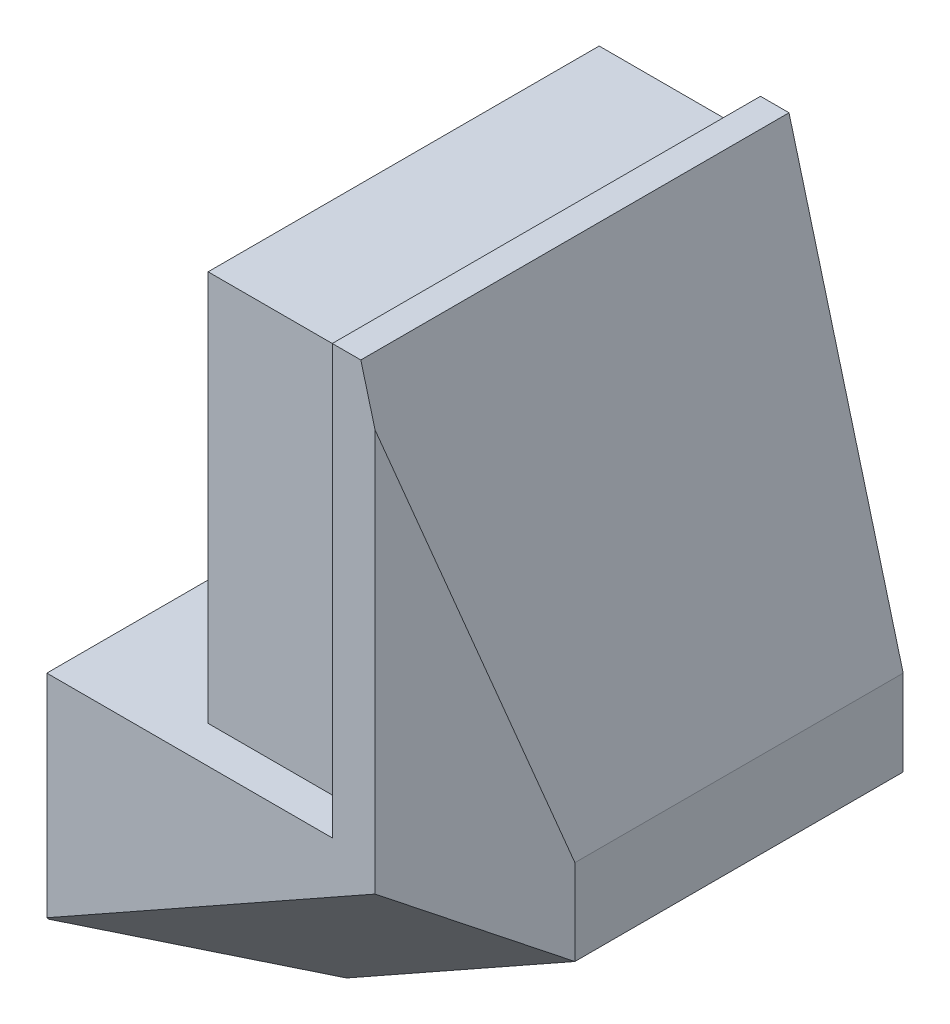
ISO-10303-21;
HEADER;
FILE_DESCRIPTION(('STEP AP214'),'2;1');
FILE_NAME('part.step','',(''),(''),'','','');
FILE_SCHEMA(('AUTOMOTIVE_DESIGN { 1 0 10303 214 1 1 1 1 }'));
ENDSEC;
DATA;
#1=APPLICATION_CONTEXT('core data for automotive mechanical design processes');
#2=APPLICATION_PROTOCOL_DEFINITION('international standard','automotive_design',2000,#1);
#3=PRODUCT_CONTEXT('',#1,'mechanical');
#4=PRODUCT('Part','Part','',(#3));
#5=PRODUCT_RELATED_PRODUCT_CATEGORY('part','',(#4));
#6=PRODUCT_DEFINITION_FORMATION('','',#4);
#7=PRODUCT_DEFINITION_CONTEXT('part definition',#1,'design');
#8=PRODUCT_DEFINITION('design','',#6,#7);
#9=PRODUCT_DEFINITION_SHAPE('','',#8);
#10=(LENGTH_UNIT() NAMED_UNIT(*) SI_UNIT(.MILLI.,.METRE.));
#11=(NAMED_UNIT(*) PLANE_ANGLE_UNIT() SI_UNIT($,.RADIAN.));
#12=(NAMED_UNIT(*) SI_UNIT($,.STERADIAN.) SOLID_ANGLE_UNIT());
#13=UNCERTAINTY_MEASURE_WITH_UNIT(LENGTH_MEASURE(1.E-05),#10,'distance_accuracy_value','');
#14=(GEOMETRIC_REPRESENTATION_CONTEXT(3) GLOBAL_UNCERTAINTY_ASSIGNED_CONTEXT((#13)) GLOBAL_UNIT_ASSIGNED_CONTEXT((#10,
#11,#12)) REPRESENTATION_CONTEXT('',''));
#15=CARTESIAN_POINT('',(0.,0.,0.));
#16=DIRECTION('',(0.,0.,1.));
#17=DIRECTION('',(1.,0.,0.));
#18=AXIS2_PLACEMENT_3D('',#15,#16,#17);
#19=CARTESIAN_POINT('',(0.,0.,30.));
#20=DIRECTION('',(1.,0.,0.));
#21=DIRECTION('',(0.,0.,-1.));
#22=AXIS2_PLACEMENT_3D('',#19,#20,#21);
#23=PLANE('',#22);
#24=DIRECTION('',(0.,-1.,0.));
#25=VECTOR('',#24,1.);
#26=CARTESIAN_POINT('',(0.,0.,0.));
#27=LINE('',#26,#25);
#28=CARTESIAN_POINT('',(0.,30.,0.));
#29=VERTEX_POINT('',#28);
#30=CARTESIAN_POINT('',(0.,0.,0.));
#31=VERTEX_POINT('',#30);
#32=EDGE_CURVE('E275',#29,#31,#27,.T.);
#33=ORIENTED_EDGE('',*,*,#32,.T.);
#34=DIRECTION('',(0.,0.,-1.));
#35=VECTOR('',#34,1.);
#36=CARTESIAN_POINT('',(0.,0.,30.));
#37=LINE('',#36,#35);
#38=CARTESIAN_POINT('',(0.,0.,30.));
#39=VERTEX_POINT('',#38);
#40=EDGE_CURVE('E288',#39,#31,#37,.T.);
#41=ORIENTED_EDGE('',*,*,#40,.F.);
#42=DIRECTION('',(0.,-1.,0.));
#43=VECTOR('',#42,1.);
#44=CARTESIAN_POINT('',(0.,0.,30.));
#45=LINE('',#44,#43);
#46=CARTESIAN_POINT('',(0.,30.,30.));
#47=VERTEX_POINT('',#46);
#48=EDGE_CURVE('E285',#47,#39,#45,.T.);
#49=ORIENTED_EDGE('',*,*,#48,.F.);
#50=DIRECTION('',(0.,0.,-1.));
#51=VECTOR('',#50,1.);
#52=CARTESIAN_POINT('',(0.,30.,30.));
#53=LINE('',#52,#51);
#54=EDGE_CURVE('E319',#47,#29,#53,.T.);
#55=ORIENTED_EDGE('',*,*,#54,.T.);
#56=EDGE_LOOP('',(#33,#41,#49,#55));
#57=FACE_BOUND('',#56,.T.);
#58=DIRECTION('',(0.,0.,-1.));
#59=VECTOR('',#58,1.);
#60=CARTESIAN_POINT('',(0.,28.7,28.7));
#61=LINE('',#60,#59);
#62=CARTESIAN_POINT('',(0.,28.7,28.7));
#63=VERTEX_POINT('',#62);
#64=CARTESIAN_POINT('',(0.,28.7,1.3));
#65=VERTEX_POINT('',#64);
#66=EDGE_CURVE('E198',#63,#65,#61,.T.);
#67=ORIENTED_EDGE('',*,*,#66,.F.);
#68=DIRECTION('',(0.,1.,0.));
#69=VECTOR('',#68,1.);
#70=CARTESIAN_POINT('',(0.,1.3,28.7));
#71=LINE('',#70,#69);
#72=CARTESIAN_POINT('',(0.,1.3,28.7));
#73=VERTEX_POINT('',#72);
#74=EDGE_CURVE('E220',#73,#63,#71,.T.);
#75=ORIENTED_EDGE('',*,*,#74,.F.);
#76=DIRECTION('',(0.,0.,1.));
#77=VECTOR('',#76,1.);
#78=CARTESIAN_POINT('',(0.,1.3,1.3));
#79=LINE('',#78,#77);
#80=CARTESIAN_POINT('',(0.,1.3,1.3));
#81=VERTEX_POINT('',#80);
#82=EDGE_CURVE('E235',#81,#73,#79,.T.);
#83=ORIENTED_EDGE('',*,*,#82,.F.);
#84=DIRECTION('',(0.,-1.,0.));
#85=VECTOR('',#84,1.);
#86=CARTESIAN_POINT('',(0.,28.7,1.3));
#87=LINE('',#86,#85);
#88=EDGE_CURVE('E65',#65,#81,#87,.T.);
#89=ORIENTED_EDGE('',*,*,#88,.F.);
#90=EDGE_LOOP('',(#67,#75,#83,#89));
#91=FACE_BOUND('',#90,.T.);
#92=ADVANCED_FACE('F39',(#57,#91),#23,.F.);
#93=CARTESIAN_POINT('',(-20.,0.,30.));
#94=DIRECTION('',(0.,-1.,0.));
#95=DIRECTION('',(0.,0.,-1.));
#96=AXIS2_PLACEMENT_3D('',#93,#94,#95);
#97=PLANE('',#96);
#98=CARTESIAN_POINT('',(-12.5,0.,15.));
#99=DIRECTION('',(0.,-1.,0.));
#100=DIRECTION('',(0.,0.,-1.));
#101=AXIS2_PLACEMENT_3D('',#98,#99,#100);
#102=CIRCLE('',#101,2.75);
#103=CARTESIAN_POINT('',(-12.5,0.,12.25));
#104=VERTEX_POINT('',#103);
#105=EDGE_CURVE('E43',#104,#104,#102,.T.);
#106=ORIENTED_EDGE('',*,*,#105,.T.);
#107=EDGE_LOOP('',(#106));
#108=FACE_BOUND('',#107,.T.);
#109=DIRECTION('',(-1.,0.,0.));
#110=VECTOR('',#109,1.);
#111=CARTESIAN_POINT('',(-20.,0.,0.));
#112=LINE('',#111,#110);
#113=CARTESIAN_POINT('',(-20.,0.,0.));
#114=VERTEX_POINT('',#113);
#115=EDGE_CURVE('E264',#31,#114,#112,.T.);
#116=ORIENTED_EDGE('',*,*,#115,.T.);
#117=DIRECTION('',(0.,0.,-1.));
#118=VECTOR('',#117,1.);
#119=CARTESIAN_POINT('',(-20.,0.,30.));
#120=LINE('',#119,#118);
#121=CARTESIAN_POINT('',(-20.,0.,30.));
#122=VERTEX_POINT('',#121);
#123=EDGE_CURVE('E339',#122,#114,#120,.T.);
#124=ORIENTED_EDGE('',*,*,#123,.F.);
#125=DIRECTION('',(-1.,0.,0.));
#126=VECTOR('',#125,1.);
#127=CARTESIAN_POINT('',(-20.,0.,30.));
#128=LINE('',#127,#126);
#129=EDGE_CURVE('E270',#39,#122,#128,.T.);
#130=ORIENTED_EDGE('',*,*,#129,.F.);
#131=ORIENTED_EDGE('',*,*,#40,.T.);
#132=EDGE_LOOP('',(#116,#124,#130,#131));
#133=FACE_BOUND('',#132,.T.);
#134=ADVANCED_FACE('F370',(#108,#133),#97,.F.);
#135=CARTESIAN_POINT('',(-20.,-15.,30.));
#136=DIRECTION('',(1.,0.,0.));
#137=DIRECTION('',(0.,0.,-1.));
#138=AXIS2_PLACEMENT_3D('',#135,#136,#137);
#139=PLANE('',#138);
#140=DIRECTION('',(0.,0.,-1.));
#141=VECTOR('',#140,1.);
#142=CARTESIAN_POINT('',(-20.,-15.,30.));
#143=LINE('',#142,#141);
#144=CARTESIAN_POINT('',(-20.,-15.,29.8636573548558));
#145=VERTEX_POINT('',#144);
#146=CARTESIAN_POINT('',(-20.,-15.,0.));
#147=VERTEX_POINT('',#146);
#148=EDGE_CURVE('E336',#145,#147,#143,.T.);
#149=ORIENTED_EDGE('',*,*,#148,.F.);
#150=DIRECTION('',(0.,0.753854625211506,0.657041249882547));
#151=VECTOR('',#150,1.);
#152=CARTESIAN_POINT('',(-20.,-7.95937034712714,36.0000979262535));
#153=LINE('',#152,#151);
#154=CARTESIAN_POINT('',(-20.,-14.843567609075,30.));
#155=VERTEX_POINT('',#154);
#156=EDGE_CURVE('E356',#145,#155,#153,.T.);
#157=ORIENTED_EDGE('',*,*,#156,.T.);
#158=DIRECTION('',(0.,-1.,0.));
#159=VECTOR('',#158,1.);
#160=CARTESIAN_POINT('',(-20.,-15.,30.));
#161=LINE('',#160,#159);
#162=EDGE_CURVE('E274',#122,#155,#161,.T.);
#163=ORIENTED_EDGE('',*,*,#162,.F.);
#164=ORIENTED_EDGE('',*,*,#123,.T.);
#165=DIRECTION('',(0.,-1.,0.));
#166=VECTOR('',#165,1.);
#167=CARTESIAN_POINT('',(-20.,-15.,0.));
#168=LINE('',#167,#166);
#169=EDGE_CURVE('E292',#114,#147,#168,.T.);
#170=ORIENTED_EDGE('',*,*,#169,.T.);
#171=EDGE_LOOP('',(#149,#157,#163,#164,#170));
#172=FACE_BOUND('',#171,.T.);
#173=ADVANCED_FACE('F395',(#172),#139,.F.);
#174=CARTESIAN_POINT('',(-6.,-15.,30.));
#175=DIRECTION('',(0.,1.,0.));
#176=DIRECTION('',(0.,0.,1.));
#177=AXIS2_PLACEMENT_3D('',#174,#175,#176);
#178=PLANE('',#177);
#179=CARTESIAN_POINT('',(-12.5,-15.,15.));
#180=DIRECTION('',(0.,-1.,0.));
#181=DIRECTION('',(0.,0.,-1.));
#182=AXIS2_PLACEMENT_3D('',#179,#180,#181);
#183=CIRCLE('',#182,5.);
#184=CARTESIAN_POINT('',(-12.5,-15.,10.));
#185=VERTEX_POINT('',#184);
#186=EDGE_CURVE('E265',#185,#185,#183,.T.);
#187=ORIENTED_EDGE('',*,*,#186,.F.);
#188=EDGE_LOOP('',(#187));
#189=FACE_BOUND('',#188,.T.);
#190=DIRECTION('',(0.,0.,-1.));
#191=VECTOR('',#190,1.);
#192=CARTESIAN_POINT('',(-6.,-15.,30.));
#193=LINE('',#192,#191);
#194=CARTESIAN_POINT('',(-6.,-15.,23.));
#195=VERTEX_POINT('',#194);
#196=CARTESIAN_POINT('',(-6.,-15.,0.));
#197=VERTEX_POINT('',#196);
#198=EDGE_CURVE('E333',#195,#197,#193,.T.);
#199=ORIENTED_EDGE('',*,*,#198,.F.);
#200=DIRECTION('',(-0.897897597554297,0.,0.440204389240068));
#201=VECTOR('',#200,1.);
#202=CARTESIAN_POINT('',(-2.6915132262833,-15.,21.3779771730097));
#203=LINE('',#202,#201);
#204=EDGE_CURVE('E353',#195,#145,#203,.T.);
#205=ORIENTED_EDGE('',*,*,#204,.T.);
#206=ORIENTED_EDGE('',*,*,#148,.T.);
#207=DIRECTION('',(1.,0.,0.));
#208=VECTOR('',#207,1.);
#209=CARTESIAN_POINT('',(-6.,-15.,0.));
#210=LINE('',#209,#208);
#211=EDGE_CURVE('E296',#147,#197,#210,.T.);
#212=ORIENTED_EDGE('',*,*,#211,.T.);
#213=EDGE_LOOP('',(#199,#205,#206,#212));
#214=FACE_BOUND('',#213,.T.);
#215=ADVANCED_FACE('F417',(#189,#214),#178,.F.);
#216=CARTESIAN_POINT('',(10.,-6.,30.));
#217=DIRECTION('',(-0.490261239632559,0.871575537124549,0.));
#218=DIRECTION('',(-0.871575537124549,-0.490261239632559,0.));
#219=AXIS2_PLACEMENT_3D('',#216,#217,#218);
#220=PLANE('',#219);
#221=DIRECTION('',(0.,0.,-1.));
#222=VECTOR('',#221,1.);
#223=CARTESIAN_POINT('',(10.,-6.,30.));
#224=LINE('',#223,#222);
#225=CARTESIAN_POINT('',(10.,-6.,23.));
#226=VERTEX_POINT('',#225);
#227=CARTESIAN_POINT('',(10.,-6.,0.));
#228=VERTEX_POINT('',#227);
#229=EDGE_CURVE('E330',#226,#228,#224,.T.);
#230=ORIENTED_EDGE('',*,*,#229,.F.);
#231=DIRECTION('',(-0.871575537124549,-0.490261239632559,0.));
#232=VECTOR('',#231,1.);
#233=CARTESIAN_POINT('',(-6.,-15.,23.));
#234=LINE('',#233,#232);
#235=EDGE_CURVE('E350',#226,#195,#234,.T.);
#236=ORIENTED_EDGE('',*,*,#235,.T.);
#237=ORIENTED_EDGE('',*,*,#198,.T.);
#238=DIRECTION('',(0.871575537124549,0.490261239632559,0.));
#239=VECTOR('',#238,1.);
#240=CARTESIAN_POINT('',(10.,-6.,0.));
#241=LINE('',#240,#239);
#242=EDGE_CURVE('E300',#197,#228,#241,.T.);
#243=ORIENTED_EDGE('',*,*,#242,.T.);
#244=EDGE_LOOP('',(#230,#236,#237,#243));
#245=FACE_BOUND('',#244,.T.);
#246=ADVANCED_FACE('F413',(#245),#220,.F.);
#247=CARTESIAN_POINT('',(10.,0.,30.));
#248=DIRECTION('',(-1.,0.,0.));
#249=DIRECTION('',(0.,-1.,0.));
#250=AXIS2_PLACEMENT_3D('',#247,#248,#249);
#251=PLANE('',#250);
#252=DIRECTION('',(0.,0.,-1.));
#253=VECTOR('',#252,1.);
#254=CARTESIAN_POINT('',(10.,0.,30.));
#255=LINE('',#254,#253);
#256=CARTESIAN_POINT('',(10.,0.,23.));
#257=VERTEX_POINT('',#256);
#258=CARTESIAN_POINT('',(10.,0.,0.));
#259=VERTEX_POINT('',#258);
#260=EDGE_CURVE('E327',#257,#259,#255,.T.);
#261=ORIENTED_EDGE('',*,*,#260,.F.);
#262=DIRECTION('',(0.,-1.,0.));
#263=VECTOR('',#262,1.);
#264=CARTESIAN_POINT('',(10.,-6.,23.));
#265=LINE('',#264,#263);
#266=EDGE_CURVE('E11',#257,#226,#265,.T.);
#267=ORIENTED_EDGE('',*,*,#266,.T.);
#268=ORIENTED_EDGE('',*,*,#229,.T.);
#269=DIRECTION('',(0.,1.,0.));
#270=VECTOR('',#269,1.);
#271=CARTESIAN_POINT('',(10.,0.,0.));
#272=LINE('',#271,#270);
#273=EDGE_CURVE('E304',#228,#259,#272,.T.);
#274=ORIENTED_EDGE('',*,*,#273,.T.);
#275=EDGE_LOOP('',(#261,#267,#268,#274));
#276=FACE_BOUND('',#275,.T.);
#277=ADVANCED_FACE('F409',(#276),#251,.F.);
#278=CARTESIAN_POINT('',(2.,30.,30.));
#279=DIRECTION('',(-0.966234939601246,-0.257662650560332,0.));
#280=DIRECTION('',(0.257662650560332,-0.966234939601246,0.));
#281=AXIS2_PLACEMENT_3D('',#278,#279,#280);
#282=PLANE('',#281);
#283=DIRECTION('',(-0.257662650560332,0.966234939601246,0.));
#284=VECTOR('',#283,1.);
#285=CARTESIAN_POINT('',(2.,30.,30.));
#286=LINE('',#285,#284);
#287=CARTESIAN_POINT('',(3.00000000000002,26.2499999999999,30.));
#288=VERTEX_POINT('',#287);
#289=CARTESIAN_POINT('',(2.,30.,30.));
#290=VERTEX_POINT('',#289);
#291=EDGE_CURVE('E279',#288,#290,#286,.T.);
#292=ORIENTED_EDGE('',*,*,#291,.F.);
#293=DIRECTION('',(0.249513144620722,-0.935674292327708,-0.249513144620723));
#294=VECTOR('',#293,1.);
#295=CARTESIAN_POINT('',(9.1284046692607,3.26848249027238,23.8715953307393));
#296=LINE('',#295,#294);
#297=EDGE_CURVE('E49',#288,#257,#296,.T.);
#298=ORIENTED_EDGE('',*,*,#297,.T.);
#299=ORIENTED_EDGE('',*,*,#260,.T.);
#300=DIRECTION('',(-0.257662650560332,0.966234939601246,0.));
#301=VECTOR('',#300,1.);
#302=CARTESIAN_POINT('',(2.,30.,0.));
#303=LINE('',#302,#301);
#304=CARTESIAN_POINT('',(2.,30.,0.));
#305=VERTEX_POINT('',#304);
#306=EDGE_CURVE('E308',#259,#305,#303,.T.);
#307=ORIENTED_EDGE('',*,*,#306,.T.);
#308=DIRECTION('',(0.,0.,-1.));
#309=VECTOR('',#308,1.);
#310=CARTESIAN_POINT('',(2.,30.,30.));
#311=LINE('',#310,#309);
#312=EDGE_CURVE('E323',#290,#305,#311,.T.);
#313=ORIENTED_EDGE('',*,*,#312,.F.);
#314=EDGE_LOOP('',(#292,#298,#299,#307,#313));
#315=FACE_BOUND('',#314,.T.);
#316=ADVANCED_FACE('F405',(#315),#282,.F.);
#317=CARTESIAN_POINT('',(0.,30.,30.));
#318=DIRECTION('',(0.,-1.,0.));
#319=DIRECTION('',(0.,0.,-1.));
#320=AXIS2_PLACEMENT_3D('',#317,#318,#319);
#321=PLANE('',#320);
#322=DIRECTION('',(-1.,0.,0.));
#323=VECTOR('',#322,1.);
#324=CARTESIAN_POINT('',(0.,30.,0.));
#325=LINE('',#324,#323);
#326=EDGE_CURVE('E311',#305,#29,#325,.T.);
#327=ORIENTED_EDGE('',*,*,#326,.T.);
#328=ORIENTED_EDGE('',*,*,#54,.F.);
#329=DIRECTION('',(-1.,0.,0.));
#330=VECTOR('',#329,1.);
#331=CARTESIAN_POINT('',(0.,30.,30.));
#332=LINE('',#331,#330);
#333=EDGE_CURVE('E282',#290,#47,#332,.T.);
#334=ORIENTED_EDGE('',*,*,#333,.F.);
#335=ORIENTED_EDGE('',*,*,#312,.T.);
#336=EDGE_LOOP('',(#327,#328,#334,#335));
#337=FACE_BOUND('',#336,.T.);
#338=ADVANCED_FACE('F401',(#337),#321,.F.);
#339=CARTESIAN_POINT('',(0.,0.,30.));
#340=DIRECTION('',(0.,0.,1.));
#341=DIRECTION('',(1.,0.,0.));
#342=AXIS2_PLACEMENT_3D('',#339,#340,#341);
#343=PLANE('',#342);
#344=ORIENTED_EDGE('',*,*,#162,.T.);
#345=DIRECTION('',(0.871575537124549,0.490261239632559,0.));
#346=VECTOR('',#345,1.);
#347=CARTESIAN_POINT('',(6.56817132257209,0.101028759871837,30.));
#348=LINE('',#347,#346);
#349=CARTESIAN_POINT('',(3.00000000000001,-1.90606760907496,30.));
#350=VERTEX_POINT('',#349);
#351=EDGE_CURVE('E346',#155,#350,#348,.T.);
#352=ORIENTED_EDGE('',*,*,#351,.T.);
#353=DIRECTION('',(0.,1.,0.));
#354=VECTOR('',#353,1.);
#355=CARTESIAN_POINT('',(3.00000000000001,0.,30.));
#356=LINE('',#355,#354);
#357=EDGE_CURVE('E343',#350,#288,#356,.T.);
#358=ORIENTED_EDGE('',*,*,#357,.T.);
#359=ORIENTED_EDGE('',*,*,#291,.T.);
#360=ORIENTED_EDGE('',*,*,#333,.T.);
#361=ORIENTED_EDGE('',*,*,#48,.T.);
#362=ORIENTED_EDGE('',*,*,#129,.T.);
#363=EDGE_LOOP('',(#344,#352,#358,#359,#360,#361,#362));
#364=FACE_BOUND('',#363,.T.);
#365=ADVANCED_FACE('F404',(#364),#343,.T.);
#366=CARTESIAN_POINT('',(0.,0.,0.));
#367=DIRECTION('',(0.,0.,1.));
#368=DIRECTION('',(1.,0.,0.));
#369=AXIS2_PLACEMENT_3D('',#366,#367,#368);
#370=PLANE('',#369);
#371=ORIENTED_EDGE('',*,*,#115,.F.);
#372=ORIENTED_EDGE('',*,*,#32,.F.);
#373=ORIENTED_EDGE('',*,*,#326,.F.);
#374=ORIENTED_EDGE('',*,*,#306,.F.);
#375=ORIENTED_EDGE('',*,*,#273,.F.);
#376=ORIENTED_EDGE('',*,*,#242,.F.);
#377=ORIENTED_EDGE('',*,*,#211,.F.);
#378=ORIENTED_EDGE('',*,*,#169,.F.);
#379=EDGE_LOOP('',(#371,#372,#373,#374,#375,#376,#377,#378));
#380=FACE_BOUND('',#379,.T.);
#381=ADVANCED_FACE('F399',(#380),#370,.F.);
#382=CARTESIAN_POINT('',(-12.5,-9.,15.));
#383=DIRECTION('',(0.,-1.,0.));
#384=DIRECTION('',(0.,0.,-1.));
#385=AXIS2_PLACEMENT_3D('',#382,#383,#384);
#386=CYLINDRICAL_SURFACE('',#385,5.);
#387=CARTESIAN_POINT('',(-12.5,-9.,15.));
#388=DIRECTION('',(0.,-1.,0.));
#389=DIRECTION('',(0.,0.,-1.));
#390=AXIS2_PLACEMENT_3D('',#387,#388,#389);
#391=CIRCLE('',#390,5.);
#392=CARTESIAN_POINT('',(-12.5,-9.,10.));
#393=VERTEX_POINT('',#392);
#394=EDGE_CURVE('E260',#393,#393,#391,.T.);
#395=ORIENTED_EDGE('',*,*,#394,.F.);
#396=EDGE_LOOP('',(#395));
#397=FACE_BOUND('',#396,.T.);
#398=ORIENTED_EDGE('',*,*,#186,.T.);
#399=EDGE_LOOP('',(#398));
#400=FACE_BOUND('',#399,.T.);
#401=ADVANCED_FACE('F460',(#397,#400),#386,.F.);
#402=CARTESIAN_POINT('',(-12.5,-9.,15.));
#403=DIRECTION('',(0.,-1.,0.));
#404=DIRECTION('',(0.,0.,-1.));
#405=AXIS2_PLACEMENT_3D('',#402,#403,#404);
#406=PLANE('',#405);
#407=CARTESIAN_POINT('',(-12.5,-9.,15.));
#408=DIRECTION('',(0.,-1.,0.));
#409=DIRECTION('',(0.,0.,-1.));
#410=AXIS2_PLACEMENT_3D('',#407,#408,#409);
#411=CIRCLE('',#410,2.75);
#412=CARTESIAN_POINT('',(-12.5,-9.,12.25));
#413=VERTEX_POINT('',#412);
#414=EDGE_CURVE('E256',#413,#413,#411,.T.);
#415=ORIENTED_EDGE('',*,*,#414,.F.);
#416=EDGE_LOOP('',(#415));
#417=FACE_BOUND('',#416,.T.);
#418=ORIENTED_EDGE('',*,*,#394,.T.);
#419=EDGE_LOOP('',(#418));
#420=FACE_BOUND('',#419,.T.);
#421=ADVANCED_FACE('F455',(#417,#420),#406,.T.);
#422=CARTESIAN_POINT('',(3.00000000000001,0.,30.));
#423=DIRECTION('',(0.707106781186549,0.,0.707106781186546));
#424=DIRECTION('',(0.,-1.,0.));
#425=AXIS2_PLACEMENT_3D('',#422,#423,#424);
#426=PLANE('',#425);
#427=ORIENTED_EDGE('',*,*,#297,.F.);
#428=ORIENTED_EDGE('',*,*,#357,.F.);
#429=DIRECTION('',(0.653434763652585,-0.382159677753396,-0.653434763652587));
#430=VECTOR('',#429,1.);
#431=CARTESIAN_POINT('',(2.52402362284203,-1.62769402225179,30.475976377158));
#432=LINE('',#431,#430);
#433=EDGE_CURVE('E269',#226,#350,#432,.F.);
#434=ORIENTED_EDGE('',*,*,#433,.F.);
#435=ORIENTED_EDGE('',*,*,#266,.F.);
#436=EDGE_LOOP('',(#427,#428,#434,#435));
#437=FACE_BOUND('',#436,.T.);
#438=ADVANCED_FACE('F41',(#437),#426,.T.);
#439=CARTESIAN_POINT('',(1.53553037301719,-2.72983177425279,30.));
#440=DIRECTION('',(0.346667047097106,-0.616296972617077,0.707106781186546));
#441=DIRECTION('',(-0.871575537124549,-0.490261239632559,0.));
#442=AXIS2_PLACEMENT_3D('',#439,#440,#441);
#443=PLANE('',#442);
#444=ORIENTED_EDGE('',*,*,#204,.F.);
#445=ORIENTED_EDGE('',*,*,#235,.F.);
#446=ORIENTED_EDGE('',*,*,#433,.T.);
#447=ORIENTED_EDGE('',*,*,#351,.F.);
#448=ORIENTED_EDGE('',*,*,#156,.F.);
#449=EDGE_LOOP('',(#444,#445,#446,#447,#448));
#450=FACE_BOUND('',#449,.T.);
#451=ADVANCED_FACE('F376',(#450),#443,.T.);
#452=CARTESIAN_POINT('',(-12.5,30.,15.));
#453=DIRECTION('',(0.,-1.,0.));
#454=DIRECTION('',(0.,0.,-1.));
#455=AXIS2_PLACEMENT_3D('',#452,#453,#454);
#456=CYLINDRICAL_SURFACE('',#455,2.75);
#457=ORIENTED_EDGE('',*,*,#414,.T.);
#458=EDGE_LOOP('',(#457));
#459=FACE_BOUND('',#458,.T.);
#460=ORIENTED_EDGE('',*,*,#105,.F.);
#461=EDGE_LOOP('',(#460));
#462=FACE_BOUND('',#461,.T.);
#463=ADVANCED_FACE('F373',(#459,#462),#456,.F.);
#464=CARTESIAN_POINT('',(-10.,28.7,28.7));
#465=DIRECTION('',(0.,-1.,0.));
#466=DIRECTION('',(0.,0.,-1.));
#467=AXIS2_PLACEMENT_3D('',#464,#465,#466);
#468=PLANE('',#467);
#469=ORIENTED_EDGE('',*,*,#66,.T.);
#470=DIRECTION('',(1.,0.,0.));
#471=VECTOR('',#470,1.);
#472=CARTESIAN_POINT('',(-10.,28.7,1.3));
#473=LINE('',#472,#471);
#474=CARTESIAN_POINT('',(-10.,28.7,1.3));
#475=VERTEX_POINT('',#474);
#476=EDGE_CURVE('E253',#475,#65,#473,.T.);
#477=ORIENTED_EDGE('',*,*,#476,.F.);
#478=DIRECTION('',(0.,0.,-1.));
#479=VECTOR('',#478,1.);
#480=CARTESIAN_POINT('',(-10.,28.7,28.7));
#481=LINE('',#480,#479);
#482=CARTESIAN_POINT('',(-10.,28.7,28.7));
#483=VERTEX_POINT('',#482);
#484=EDGE_CURVE('E215',#483,#475,#481,.T.);
#485=ORIENTED_EDGE('',*,*,#484,.F.);
#486=DIRECTION('',(1.,0.,0.));
#487=VECTOR('',#486,1.);
#488=CARTESIAN_POINT('',(-10.,28.7,28.7));
#489=LINE('',#488,#487);
#490=EDGE_CURVE('E229',#483,#63,#489,.T.);
#491=ORIENTED_EDGE('',*,*,#490,.T.);
#492=EDGE_LOOP('',(#469,#477,#485,#491));
#493=FACE_BOUND('',#492,.T.);
#494=ADVANCED_FACE('F375',(#493),#468,.F.);
#495=CARTESIAN_POINT('',(-10.,28.7,1.3));
#496=DIRECTION('',(0.,0.,1.));
#497=DIRECTION('',(1.,0.,0.));
#498=AXIS2_PLACEMENT_3D('',#495,#496,#497);
#499=PLANE('',#498);
#500=ORIENTED_EDGE('',*,*,#88,.T.);
#501=DIRECTION('',(1.,0.,0.));
#502=VECTOR('',#501,1.);
#503=CARTESIAN_POINT('',(-10.,1.3,1.3));
#504=LINE('',#503,#502);
#505=CARTESIAN_POINT('',(-10.,1.3,1.3));
#506=VERTEX_POINT('',#505);
#507=EDGE_CURVE('E249',#506,#81,#504,.T.);
#508=ORIENTED_EDGE('',*,*,#507,.F.);
#509=DIRECTION('',(0.,-1.,0.));
#510=VECTOR('',#509,1.);
#511=CARTESIAN_POINT('',(-10.,28.7,1.3));
#512=LINE('',#511,#510);
#513=EDGE_CURVE('E219',#475,#506,#512,.T.);
#514=ORIENTED_EDGE('',*,*,#513,.F.);
#515=ORIENTED_EDGE('',*,*,#476,.T.);
#516=EDGE_LOOP('',(#500,#508,#514,#515));
#517=FACE_BOUND('',#516,.T.);
#518=ADVANCED_FACE('F384',(#517),#499,.F.);
#519=CARTESIAN_POINT('',(-10.,1.3,1.3));
#520=DIRECTION('',(0.,1.,0.));
#521=DIRECTION('',(0.,0.,1.));
#522=AXIS2_PLACEMENT_3D('',#519,#520,#521);
#523=PLANE('',#522);
#524=ORIENTED_EDGE('',*,*,#82,.T.);
#525=DIRECTION('',(1.,0.,0.));
#526=VECTOR('',#525,1.);
#527=CARTESIAN_POINT('',(-10.,1.3,28.7));
#528=LINE('',#527,#526);
#529=CARTESIAN_POINT('',(-10.,1.3,28.7));
#530=VERTEX_POINT('',#529);
#531=EDGE_CURVE('E245',#530,#73,#528,.T.);
#532=ORIENTED_EDGE('',*,*,#531,.F.);
#533=DIRECTION('',(0.,0.,1.));
#534=VECTOR('',#533,1.);
#535=CARTESIAN_POINT('',(-10.,1.3,1.3));
#536=LINE('',#535,#534);
#537=EDGE_CURVE('E223',#506,#530,#536,.T.);
#538=ORIENTED_EDGE('',*,*,#537,.F.);
#539=ORIENTED_EDGE('',*,*,#507,.T.);
#540=EDGE_LOOP('',(#524,#532,#538,#539));
#541=FACE_BOUND('',#540,.T.);
#542=ADVANCED_FACE('F514',(#541),#523,.F.);
#543=CARTESIAN_POINT('',(-10.,1.3,28.7));
#544=DIRECTION('',(0.,0.,-1.));
#545=DIRECTION('',(-1.,0.,0.));
#546=AXIS2_PLACEMENT_3D('',#543,#544,#545);
#547=PLANE('',#546);
#548=ORIENTED_EDGE('',*,*,#74,.T.);
#549=ORIENTED_EDGE('',*,*,#490,.F.);
#550=DIRECTION('',(0.,1.,0.));
#551=VECTOR('',#550,1.);
#552=CARTESIAN_POINT('',(-10.,1.3,28.7));
#553=LINE('',#552,#551);
#554=EDGE_CURVE('E226',#530,#483,#553,.T.);
#555=ORIENTED_EDGE('',*,*,#554,.F.);
#556=ORIENTED_EDGE('',*,*,#531,.T.);
#557=EDGE_LOOP('',(#548,#549,#555,#556));
#558=FACE_BOUND('',#557,.T.);
#559=ADVANCED_FACE('F523',(#558),#547,.F.);
#560=CARTESIAN_POINT('',(-10.,0.,0.));
#561=DIRECTION('',(-1.,0.,0.));
#562=DIRECTION('',(0.,0.,1.));
#563=AXIS2_PLACEMENT_3D('',#560,#561,#562);
#564=PLANE('',#563);
#565=DIRECTION('',(0.,1.,0.));
#566=VECTOR('',#565,1.);
#567=CARTESIAN_POINT('',(-10.,2.6,27.4));
#568=LINE('',#567,#566);
#569=CARTESIAN_POINT('',(-10.,2.6,27.4));
#570=VERTEX_POINT('',#569);
#571=CARTESIAN_POINT('',(-10.,27.4,27.4));
#572=VERTEX_POINT('',#571);
#573=EDGE_CURVE('E57',#570,#572,#568,.T.);
#574=ORIENTED_EDGE('',*,*,#573,.F.);
#575=DIRECTION('',(0.,0.,1.));
#576=VECTOR('',#575,1.);
#577=CARTESIAN_POINT('',(-10.,2.6,2.6));
#578=LINE('',#577,#576);
#579=CARTESIAN_POINT('',(-10.,2.6,2.6));
#580=VERTEX_POINT('',#579);
#581=EDGE_CURVE('E187',#580,#570,#578,.T.);
#582=ORIENTED_EDGE('',*,*,#581,.F.);
#583=DIRECTION('',(0.,-1.,0.));
#584=VECTOR('',#583,1.);
#585=CARTESIAN_POINT('',(-10.,27.4,2.6));
#586=LINE('',#585,#584);
#587=CARTESIAN_POINT('',(-10.,27.4,2.6));
#588=VERTEX_POINT('',#587);
#589=EDGE_CURVE('E167',#588,#580,#586,.T.);
#590=ORIENTED_EDGE('',*,*,#589,.F.);
#591=DIRECTION('',(0.,0.,-1.));
#592=VECTOR('',#591,1.);
#593=CARTESIAN_POINT('',(-10.,27.4,27.4));
#594=LINE('',#593,#592);
#595=EDGE_CURVE('E179',#572,#588,#594,.T.);
#596=ORIENTED_EDGE('',*,*,#595,.F.);
#597=EDGE_LOOP('',(#574,#582,#590,#596));
#598=FACE_BOUND('',#597,.T.);
#599=ORIENTED_EDGE('',*,*,#484,.T.);
#600=ORIENTED_EDGE('',*,*,#513,.T.);
#601=ORIENTED_EDGE('',*,*,#537,.T.);
#602=ORIENTED_EDGE('',*,*,#554,.T.);
#603=EDGE_LOOP('',(#599,#600,#601,#602));
#604=FACE_BOUND('',#603,.T.);
#605=ADVANCED_FACE('F184',(#598,#604),#564,.T.);
#606=CARTESIAN_POINT('',(-10.,2.6,27.4));
#607=DIRECTION('',(0.64278760968654,0.,0.766044443118977));
#608=DIRECTION('',(0.766044443118977,0.,-0.64278760968654));
#609=AXIS2_PLACEMENT_3D('',#606,#607,#608);
#610=PLANE('',#609);
#611=ORIENTED_EDGE('',*,*,#573,.T.);
#612=DIRECTION('',(-0.644400477571771,0.540716203060937,0.540716203060937));
#613=VECTOR('',#612,1.);
#614=CARTESIAN_POINT('',(-1.35874306881509,20.1491244961346,20.1491244961346));
#615=LINE('',#614,#613);
#616=CARTESIAN_POINT('',(2.,17.3308044258726,17.3308044258726));
#617=VERTEX_POINT('',#616);
#618=EDGE_CURVE('E176',#617,#572,#615,.T.);
#619=ORIENTED_EDGE('',*,*,#618,.F.);
#620=DIRECTION('',(0.,1.,0.));
#621=VECTOR('',#620,1.);
#622=CARTESIAN_POINT('',(2.,0.,17.3308044258726));
#623=LINE('',#622,#621);
#624=CARTESIAN_POINT('',(2.,12.6691955741274,17.3308044258726));
#625=VERTEX_POINT('',#624);
#626=EDGE_CURVE('E191',#625,#617,#623,.T.);
#627=ORIENTED_EDGE('',*,*,#626,.F.);
#628=DIRECTION('',(-0.644400477571771,-0.540716203060937,0.540716203060937));
#629=VECTOR('',#628,1.);
#630=CARTESIAN_POINT('',(-1.35874306881509,9.8508755038654,20.1491244961346));
#631=LINE('',#630,#629);
#632=EDGE_CURVE('E195',#625,#570,#631,.T.);
#633=ORIENTED_EDGE('',*,*,#632,.T.);
#634=EDGE_LOOP('',(#611,#619,#627,#633));
#635=FACE_BOUND('',#634,.T.);
#636=ADVANCED_FACE('F540',(#635),#610,.F.);
#637=CARTESIAN_POINT('',(-10.,2.6,2.6));
#638=DIRECTION('',(0.64278760968654,-0.766044443118977,0.));
#639=DIRECTION('',(0.766044443118977,0.64278760968654,0.));
#640=AXIS2_PLACEMENT_3D('',#637,#638,#639);
#641=PLANE('',#640);
#642=ORIENTED_EDGE('',*,*,#581,.T.);
#643=ORIENTED_EDGE('',*,*,#632,.F.);
#644=DIRECTION('',(0.,0.,1.));
#645=VECTOR('',#644,1.);
#646=CARTESIAN_POINT('',(2.,12.6691955741274,0.));
#647=LINE('',#646,#645);
#648=CARTESIAN_POINT('',(2.,12.6691955741274,12.6691955741274));
#649=VERTEX_POINT('',#648);
#650=EDGE_CURVE('E200',#649,#625,#647,.T.);
#651=ORIENTED_EDGE('',*,*,#650,.F.);
#652=DIRECTION('',(-0.644400477571771,-0.540716203060937,-0.540716203060937));
#653=VECTOR('',#652,1.);
#654=CARTESIAN_POINT('',(-1.35874306881509,9.85087550386539,9.8508755038654));
#655=LINE('',#654,#653);
#656=EDGE_CURVE('E175',#649,#580,#655,.T.);
#657=ORIENTED_EDGE('',*,*,#656,.T.);
#658=EDGE_LOOP('',(#642,#643,#651,#657));
#659=FACE_BOUND('',#658,.T.);
#660=ADVANCED_FACE('F548',(#659),#641,.F.);
#661=CARTESIAN_POINT('',(-10.,27.4,2.6));
#662=DIRECTION('',(0.64278760968654,0.,-0.766044443118977));
#663=DIRECTION('',(-0.766044443118977,0.,-0.64278760968654));
#664=AXIS2_PLACEMENT_3D('',#661,#662,#663);
#665=PLANE('',#664);
#666=ORIENTED_EDGE('',*,*,#589,.T.);
#667=ORIENTED_EDGE('',*,*,#656,.F.);
#668=DIRECTION('',(0.,-1.,0.));
#669=VECTOR('',#668,1.);
#670=CARTESIAN_POINT('',(2.,0.,12.6691955741274));
#671=LINE('',#670,#669);
#672=CARTESIAN_POINT('',(2.,17.3308044258726,12.6691955741274));
#673=VERTEX_POINT('',#672);
#674=EDGE_CURVE('E170',#673,#649,#671,.T.);
#675=ORIENTED_EDGE('',*,*,#674,.F.);
#676=DIRECTION('',(-0.644400477571771,0.540716203060937,-0.540716203060937));
#677=VECTOR('',#676,1.);
#678=CARTESIAN_POINT('',(-1.35874306881509,20.1491244961346,9.85087550386539));
#679=LINE('',#678,#677);
#680=EDGE_CURVE('E163',#673,#588,#679,.T.);
#681=ORIENTED_EDGE('',*,*,#680,.T.);
#682=EDGE_LOOP('',(#666,#667,#675,#681));
#683=FACE_BOUND('',#682,.T.);
#684=ADVANCED_FACE('F165',(#683),#665,.F.);
#685=CARTESIAN_POINT('',(-10.,27.4,27.4));
#686=DIRECTION('',(0.64278760968654,0.766044443118977,0.));
#687=DIRECTION('',(-0.766044443118977,0.64278760968654,0.));
#688=AXIS2_PLACEMENT_3D('',#685,#686,#687);
#689=PLANE('',#688);
#690=ORIENTED_EDGE('',*,*,#595,.T.);
#691=ORIENTED_EDGE('',*,*,#680,.F.);
#692=DIRECTION('',(0.,0.,-1.));
#693=VECTOR('',#692,1.);
#694=CARTESIAN_POINT('',(2.,17.3308044258726,0.));
#695=LINE('',#694,#693);
#696=EDGE_CURVE('E207',#617,#673,#695,.T.);
#697=ORIENTED_EDGE('',*,*,#696,.F.);
#698=ORIENTED_EDGE('',*,*,#618,.T.);
#699=EDGE_LOOP('',(#690,#691,#697,#698));
#700=FACE_BOUND('',#699,.T.);
#701=ADVANCED_FACE('F180',(#700),#689,.F.);
#702=CARTESIAN_POINT('',(2.,0.,0.));
#703=DIRECTION('',(-1.,0.,0.));
#704=DIRECTION('',(0.,0.,1.));
#705=AXIS2_PLACEMENT_3D('',#702,#703,#704);
#706=PLANE('',#705);
#707=ORIENTED_EDGE('',*,*,#626,.T.);
#708=ORIENTED_EDGE('',*,*,#696,.T.);
#709=ORIENTED_EDGE('',*,*,#674,.T.);
#710=ORIENTED_EDGE('',*,*,#650,.T.);
#711=EDGE_LOOP('',(#707,#708,#709,#710));
#712=FACE_BOUND('',#711,.T.);
#713=ADVANCED_FACE('F571',(#712),#706,.T.);
#714=CLOSED_SHELL('',(#92,#134,#173,#215,#246,#277,#316,#338,#365,#381,#401,#421,#438,#451,#463,
#494,#518,#542,#559,#605,#636,#660,#684,#701,#713));
#715=MANIFOLD_SOLID_BREP('B2',#714);
#716=ADVANCED_BREP_SHAPE_REPRESENTATION('',(#18,#715),#14);
#717=SHAPE_DEFINITION_REPRESENTATION(#9,#716);
ENDSEC;
END-ISO-10303-21;
